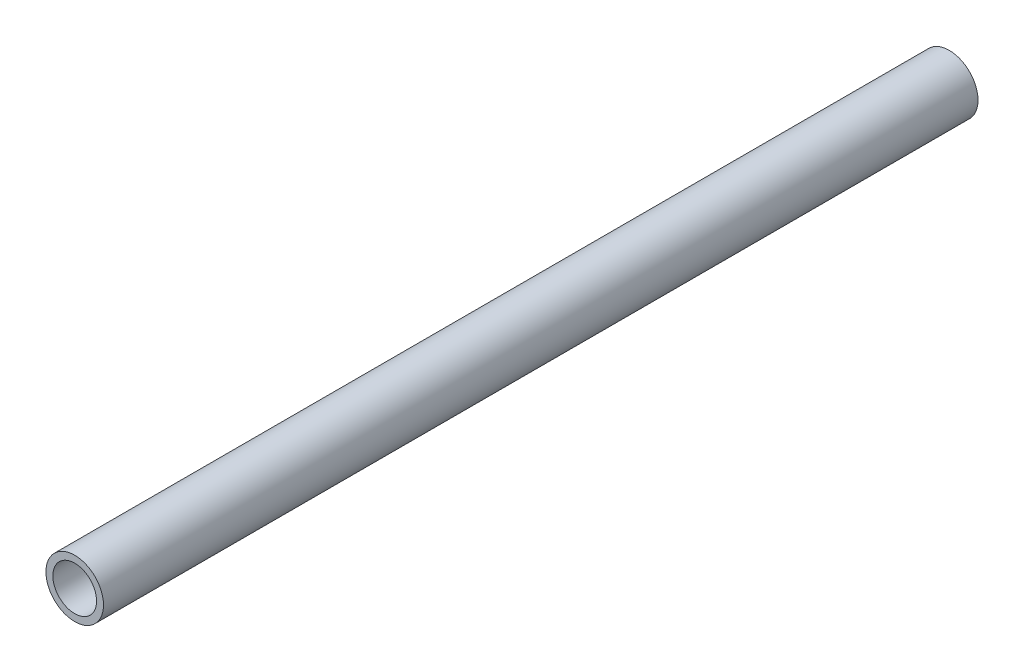
ISO-10303-21;
HEADER;
FILE_DESCRIPTION(('STEP AP214'),'2;1');
FILE_NAME('part.step','',(''),(''),'','','');
FILE_SCHEMA(('AUTOMOTIVE_DESIGN { 1 0 10303 214 1 1 1 1 }'));
ENDSEC;
DATA;
#1=APPLICATION_CONTEXT('core data for automotive mechanical design processes');
#2=APPLICATION_PROTOCOL_DEFINITION('international standard','automotive_design',2000,#1);
#3=PRODUCT_CONTEXT('',#1,'mechanical');
#4=PRODUCT('Part','Part','',(#3));
#5=PRODUCT_RELATED_PRODUCT_CATEGORY('part','',(#4));
#6=PRODUCT_DEFINITION_FORMATION('','',#4);
#7=PRODUCT_DEFINITION_CONTEXT('part definition',#1,'design');
#8=PRODUCT_DEFINITION('design','',#6,#7);
#9=PRODUCT_DEFINITION_SHAPE('','',#8);
#10=(LENGTH_UNIT() NAMED_UNIT(*) SI_UNIT(.MILLI.,.METRE.));
#11=(NAMED_UNIT(*) PLANE_ANGLE_UNIT() SI_UNIT($,.RADIAN.));
#12=(NAMED_UNIT(*) SI_UNIT($,.STERADIAN.) SOLID_ANGLE_UNIT());
#13=UNCERTAINTY_MEASURE_WITH_UNIT(LENGTH_MEASURE(1.E-05),#10,'distance_accuracy_value','');
#14=(GEOMETRIC_REPRESENTATION_CONTEXT(3) GLOBAL_UNCERTAINTY_ASSIGNED_CONTEXT((#13)) GLOBAL_UNIT_ASSIGNED_CONTEXT((#10,
#11,#12)) REPRESENTATION_CONTEXT('',''));
#15=CARTESIAN_POINT('',(0.,0.,0.));
#16=DIRECTION('',(0.,0.,1.));
#17=DIRECTION('',(1.,0.,0.));
#18=AXIS2_PLACEMENT_3D('',#15,#16,#17);
#19=CARTESIAN_POINT('',(0.,0.,190.));
#20=DIRECTION('',(0.,0.,1.));
#21=DIRECTION('',(1.,0.,0.));
#22=AXIS2_PLACEMENT_3D('',#19,#20,#21);
#23=PLANE('',#22);
#24=CARTESIAN_POINT('',(0.,0.,190.));
#25=DIRECTION('',(0.,0.,1.));
#26=DIRECTION('',(1.,0.,0.));
#27=AXIS2_PLACEMENT_3D('',#24,#25,#26);
#28=CIRCLE('',#27,12.5);
#29=CARTESIAN_POINT('',(12.5,0.,190.));
#30=VERTEX_POINT('',#29);
#31=EDGE_CURVE('E11',#30,#30,#28,.T.);
#32=ORIENTED_EDGE('',*,*,#31,.T.);
#33=EDGE_LOOP('',(#32));
#34=FACE_BOUND('',#33,.T.);
#35=CARTESIAN_POINT('',(0.,0.,190.));
#36=DIRECTION('',(0.,0.,1.));
#37=DIRECTION('',(1.,0.,0.));
#38=AXIS2_PLACEMENT_3D('',#35,#36,#37);
#39=CIRCLE('',#38,9.5);
#40=CARTESIAN_POINT('',(9.5,0.,190.));
#41=VERTEX_POINT('',#40);
#42=EDGE_CURVE('E50',#41,#41,#39,.T.);
#43=ORIENTED_EDGE('',*,*,#42,.F.);
#44=EDGE_LOOP('',(#43));
#45=FACE_BOUND('',#44,.T.);
#46=ADVANCED_FACE('F39',(#34,#45),#23,.T.);
#47=CARTESIAN_POINT('',(0.,0.,-190.));
#48=DIRECTION('',(0.,0.,1.));
#49=DIRECTION('',(1.,0.,0.));
#50=AXIS2_PLACEMENT_3D('',#47,#48,#49);
#51=PLANE('',#50);
#52=CARTESIAN_POINT('',(0.,0.,-190.));
#53=DIRECTION('',(0.,0.,1.));
#54=DIRECTION('',(1.,0.,0.));
#55=AXIS2_PLACEMENT_3D('',#52,#53,#54);
#56=CIRCLE('',#55,12.5);
#57=CARTESIAN_POINT('',(12.5,0.,-190.));
#58=VERTEX_POINT('',#57);
#59=EDGE_CURVE('E43',#58,#58,#56,.T.);
#60=ORIENTED_EDGE('',*,*,#59,.F.);
#61=EDGE_LOOP('',(#60));
#62=FACE_BOUND('',#61,.T.);
#63=CARTESIAN_POINT('',(0.,0.,-190.));
#64=DIRECTION('',(0.,0.,1.));
#65=DIRECTION('',(1.,0.,0.));
#66=AXIS2_PLACEMENT_3D('',#63,#64,#65);
#67=CIRCLE('',#66,9.5);
#68=CARTESIAN_POINT('',(9.5,0.,-190.));
#69=VERTEX_POINT('',#68);
#70=EDGE_CURVE('E52',#69,#69,#67,.T.);
#71=ORIENTED_EDGE('',*,*,#70,.T.);
#72=EDGE_LOOP('',(#71));
#73=FACE_BOUND('',#72,.T.);
#74=ADVANCED_FACE('F62',(#62,#73),#51,.F.);
#75=CARTESIAN_POINT('',(0.,0.,190.));
#76=DIRECTION('',(0.,0.,-1.));
#77=DIRECTION('',(-1.,0.,0.));
#78=AXIS2_PLACEMENT_3D('',#75,#76,#77);
#79=CYLINDRICAL_SURFACE('',#78,12.5);
#80=ORIENTED_EDGE('',*,*,#31,.F.);
#81=EDGE_LOOP('',(#80));
#82=FACE_BOUND('',#81,.T.);
#83=ORIENTED_EDGE('',*,*,#59,.T.);
#84=EDGE_LOOP('',(#83));
#85=FACE_BOUND('',#84,.T.);
#86=ADVANCED_FACE('F41',(#82,#85),#79,.T.);
#87=CARTESIAN_POINT('',(0.,0.,190.));
#88=DIRECTION('',(0.,0.,-1.));
#89=DIRECTION('',(-1.,0.,0.));
#90=AXIS2_PLACEMENT_3D('',#87,#88,#89);
#91=CYLINDRICAL_SURFACE('',#90,9.5);
#92=ORIENTED_EDGE('',*,*,#42,.T.);
#93=EDGE_LOOP('',(#92));
#94=FACE_BOUND('',#93,.T.);
#95=ORIENTED_EDGE('',*,*,#70,.F.);
#96=EDGE_LOOP('',(#95));
#97=FACE_BOUND('',#96,.T.);
#98=ADVANCED_FACE('F58',(#94,#97),#91,.F.);
#99=CLOSED_SHELL('',(#46,#74,#86,#98));
#100=MANIFOLD_SOLID_BREP('B2',#99);
#101=ADVANCED_BREP_SHAPE_REPRESENTATION('',(#18,#100),#14);
#102=SHAPE_DEFINITION_REPRESENTATION(#9,#101);
ENDSEC;
END-ISO-10303-21;
